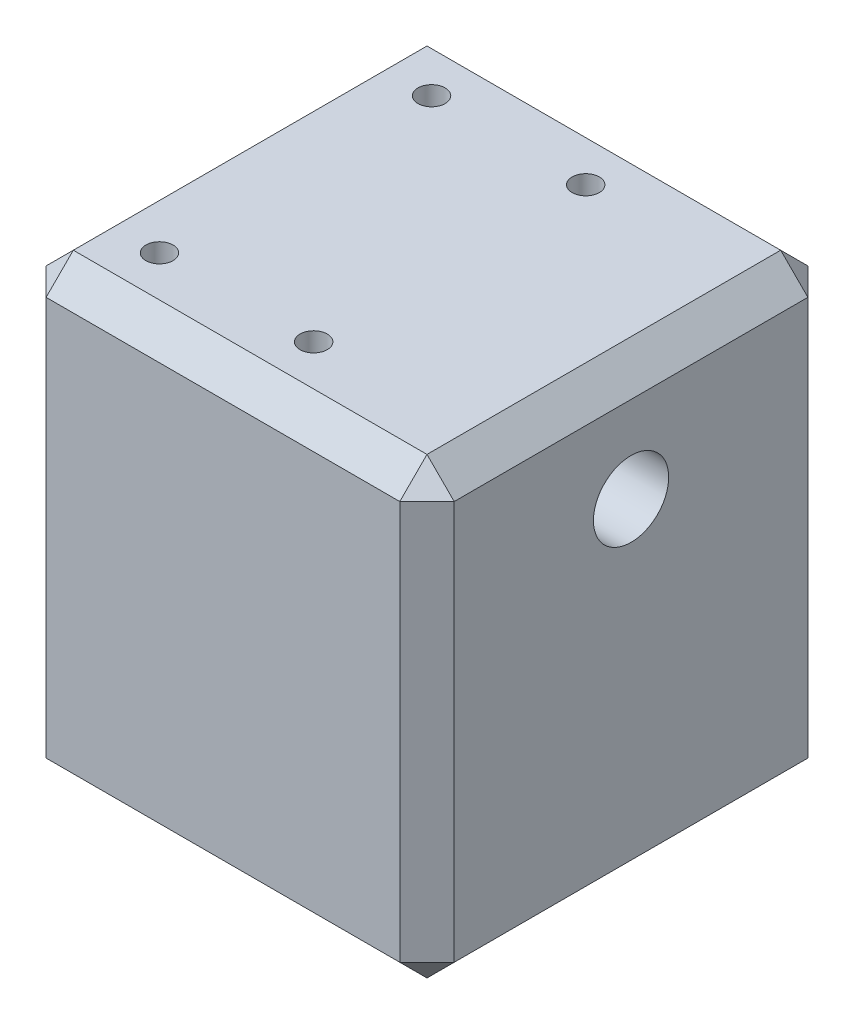
ISO-10303-21;
HEADER;
FILE_DESCRIPTION(('STEP AP214'),'2;1');
FILE_NAME('part.step','',(''),(''),'','','');
FILE_SCHEMA(('AUTOMOTIVE_DESIGN { 1 0 10303 214 1 1 1 1 }'));
ENDSEC;
DATA;
#1=APPLICATION_CONTEXT('core data for automotive mechanical design processes');
#2=APPLICATION_PROTOCOL_DEFINITION('international standard','automotive_design',2000,#1);
#3=PRODUCT_CONTEXT('',#1,'mechanical');
#4=PRODUCT('Part','Part','',(#3));
#5=PRODUCT_RELATED_PRODUCT_CATEGORY('part','',(#4));
#6=PRODUCT_DEFINITION_FORMATION('','',#4);
#7=PRODUCT_DEFINITION_CONTEXT('part definition',#1,'design');
#8=PRODUCT_DEFINITION('design','',#6,#7);
#9=PRODUCT_DEFINITION_SHAPE('','',#8);
#10=(LENGTH_UNIT() NAMED_UNIT(*) SI_UNIT(.MILLI.,.METRE.));
#11=(NAMED_UNIT(*) PLANE_ANGLE_UNIT() SI_UNIT($,.RADIAN.));
#12=(NAMED_UNIT(*) SI_UNIT($,.STERADIAN.) SOLID_ANGLE_UNIT());
#13=UNCERTAINTY_MEASURE_WITH_UNIT(LENGTH_MEASURE(1.E-05),#10,'distance_accuracy_value','');
#14=(GEOMETRIC_REPRESENTATION_CONTEXT(3) GLOBAL_UNCERTAINTY_ASSIGNED_CONTEXT((#13)) GLOBAL_UNIT_ASSIGNED_CONTEXT((#10,
#11,#12)) REPRESENTATION_CONTEXT('',''));
#15=CARTESIAN_POINT('',(0.,0.,0.));
#16=DIRECTION('',(0.,0.,1.));
#17=DIRECTION('',(1.,0.,0.));
#18=AXIS2_PLACEMENT_3D('',#15,#16,#17);
#19=CARTESIAN_POINT('',(22.5,50.,-22.5));
#20=DIRECTION('',(-1.,0.,0.));
#21=DIRECTION('',(0.,0.,1.));
#22=AXIS2_PLACEMENT_3D('',#19,#20,#21);
#23=PLANE('',#22);
#24=DIRECTION('',(0.,-1.,0.));
#25=VECTOR('',#24,1.);
#26=CARTESIAN_POINT('',(22.5,50.,19.5));
#27=LINE('',#26,#25);
#28=CARTESIAN_POINT('',(22.5,47.,19.5));
#29=VERTEX_POINT('',#28);
#30=CARTESIAN_POINT('',(22.5,3.00000000000002,19.5));
#31=VERTEX_POINT('',#30);
#32=EDGE_CURVE('E191',#29,#31,#27,.T.);
#33=ORIENTED_EDGE('',*,*,#32,.T.);
#34=DIRECTION('',(0.,0.,-1.));
#35=VECTOR('',#34,1.);
#36=CARTESIAN_POINT('',(22.5,3.00000000000002,-22.5));
#37=LINE('',#36,#35);
#38=CARTESIAN_POINT('',(22.5,3.00000000000002,-19.5));
#39=VERTEX_POINT('',#38);
#40=EDGE_CURVE('E193',#31,#39,#37,.T.);
#41=ORIENTED_EDGE('',*,*,#40,.T.);
#42=DIRECTION('',(0.,1.,0.));
#43=VECTOR('',#42,1.);
#44=CARTESIAN_POINT('',(22.5,50.,-19.5));
#45=LINE('',#44,#43);
#46=CARTESIAN_POINT('',(22.5,47.,-19.5));
#47=VERTEX_POINT('',#46);
#48=EDGE_CURVE('E187',#39,#47,#45,.T.);
#49=ORIENTED_EDGE('',*,*,#48,.T.);
#50=DIRECTION('',(0.,0.,1.));
#51=VECTOR('',#50,1.);
#52=CARTESIAN_POINT('',(22.5,47.,22.5));
#53=LINE('',#52,#51);
#54=EDGE_CURVE('E189',#47,#29,#53,.T.);
#55=ORIENTED_EDGE('',*,*,#54,.T.);
#56=EDGE_LOOP('',(#33,#41,#49,#55));
#57=FACE_BOUND('',#56,.T.);
#58=CARTESIAN_POINT('',(22.5,37.5,0.));
#59=DIRECTION('',(-1.,0.,0.));
#60=DIRECTION('',(0.,0.,1.));
#61=AXIS2_PLACEMENT_3D('',#58,#59,#60);
#62=CIRCLE('',#61,4.15);
#63=CARTESIAN_POINT('',(22.5,37.5,4.14999999999999));
#64=VERTEX_POINT('',#63);
#65=EDGE_CURVE('E273',#64,#64,#62,.T.);
#66=ORIENTED_EDGE('',*,*,#65,.T.);
#67=EDGE_LOOP('',(#66));
#68=FACE_BOUND('',#67,.T.);
#69=ADVANCED_FACE('F46',(#57,#68),#23,.F.);
#70=CARTESIAN_POINT('',(-22.5,50.,-22.5));
#71=DIRECTION('',(0.,0.,1.));
#72=DIRECTION('',(1.,0.,0.));
#73=AXIS2_PLACEMENT_3D('',#70,#71,#72);
#74=PLANE('',#73);
#75=DIRECTION('',(0.,-1.,0.));
#76=VECTOR('',#75,1.);
#77=CARTESIAN_POINT('',(19.5,50.,-22.5));
#78=LINE('',#77,#76);
#79=CARTESIAN_POINT('',(19.5,47.,-22.5));
#80=VERTEX_POINT('',#79);
#81=CARTESIAN_POINT('',(19.5,3.,-22.5));
#82=VERTEX_POINT('',#81);
#83=EDGE_CURVE('E139',#80,#82,#78,.T.);
#84=ORIENTED_EDGE('',*,*,#83,.T.);
#85=DIRECTION('',(-1.,0.,0.));
#86=VECTOR('',#85,1.);
#87=CARTESIAN_POINT('',(-22.5,3.,-22.5));
#88=LINE('',#87,#86);
#89=CARTESIAN_POINT('',(-19.5,3.,-22.5));
#90=VERTEX_POINT('',#89);
#91=EDGE_CURVE('E176',#82,#90,#88,.T.);
#92=ORIENTED_EDGE('',*,*,#91,.T.);
#93=DIRECTION('',(0.,1.,0.));
#94=VECTOR('',#93,1.);
#95=CARTESIAN_POINT('',(-19.5,50.,-22.5));
#96=LINE('',#95,#94);
#97=CARTESIAN_POINT('',(-19.5,47.,-22.5));
#98=VERTEX_POINT('',#97);
#99=EDGE_CURVE('E142',#90,#98,#96,.T.);
#100=ORIENTED_EDGE('',*,*,#99,.T.);
#101=DIRECTION('',(1.,0.,0.));
#102=VECTOR('',#101,1.);
#103=CARTESIAN_POINT('',(22.5,47.,-22.5));
#104=LINE('',#103,#102);
#105=EDGE_CURVE('E133',#98,#80,#104,.T.);
#106=ORIENTED_EDGE('',*,*,#105,.T.);
#107=EDGE_LOOP('',(#84,#92,#100,#106));
#108=FACE_BOUND('',#107,.T.);
#109=CARTESIAN_POINT('',(0.,12.5,-22.5));
#110=DIRECTION('',(0.,0.,-1.));
#111=DIRECTION('',(-1.,0.,0.));
#112=AXIS2_PLACEMENT_3D('',#109,#110,#111);
#113=CIRCLE('',#112,4.15);
#114=CARTESIAN_POINT('',(-4.15,12.5,-22.5));
#115=VERTEX_POINT('',#114);
#116=EDGE_CURVE('E171',#115,#115,#113,.T.);
#117=ORIENTED_EDGE('',*,*,#116,.F.);
#118=EDGE_LOOP('',(#117));
#119=FACE_BOUND('',#118,.T.);
#120=ADVANCED_FACE('F135',(#108,#119),#74,.F.);
#121=CARTESIAN_POINT('',(-22.5,50.,-22.5));
#122=DIRECTION('',(1.,0.,0.));
#123=DIRECTION('',(0.,0.,-1.));
#124=AXIS2_PLACEMENT_3D('',#121,#122,#123);
#125=PLANE('',#124);
#126=DIRECTION('',(0.,0.,-1.));
#127=VECTOR('',#126,1.);
#128=CARTESIAN_POINT('',(-22.5,47.,-22.5));
#129=LINE('',#128,#127);
#130=CARTESIAN_POINT('',(-22.5,47.,19.5));
#131=VERTEX_POINT('',#130);
#132=CARTESIAN_POINT('',(-22.5,47.,-19.5));
#133=VERTEX_POINT('',#132);
#134=EDGE_CURVE('E205',#131,#133,#129,.T.);
#135=ORIENTED_EDGE('',*,*,#134,.T.);
#136=DIRECTION('',(0.,-1.,0.));
#137=VECTOR('',#136,1.);
#138=CARTESIAN_POINT('',(-22.5,50.,-19.5));
#139=LINE('',#138,#137);
#140=CARTESIAN_POINT('',(-22.5,3.,-19.5));
#141=VERTEX_POINT('',#140);
#142=EDGE_CURVE('E211',#133,#141,#139,.T.);
#143=ORIENTED_EDGE('',*,*,#142,.T.);
#144=DIRECTION('',(0.,0.,1.));
#145=VECTOR('',#144,1.);
#146=CARTESIAN_POINT('',(-22.5,3.,-22.5));
#147=LINE('',#146,#145);
#148=CARTESIAN_POINT('',(-22.5,3.,19.5));
#149=VERTEX_POINT('',#148);
#150=EDGE_CURVE('E209',#141,#149,#147,.T.);
#151=ORIENTED_EDGE('',*,*,#150,.T.);
#152=DIRECTION('',(0.,1.,0.));
#153=VECTOR('',#152,1.);
#154=CARTESIAN_POINT('',(-22.5,50.,19.5));
#155=LINE('',#154,#153);
#156=EDGE_CURVE('E207',#149,#131,#155,.T.);
#157=ORIENTED_EDGE('',*,*,#156,.T.);
#158=EDGE_LOOP('',(#135,#143,#151,#157));
#159=FACE_BOUND('',#158,.T.);
#160=ADVANCED_FACE('F351',(#159),#125,.F.);
#161=CARTESIAN_POINT('',(-22.5,50.,22.5));
#162=DIRECTION('',(0.,0.,-1.));
#163=DIRECTION('',(-1.,0.,0.));
#164=AXIS2_PLACEMENT_3D('',#161,#162,#163);
#165=PLANE('',#164);
#166=DIRECTION('',(1.,0.,0.));
#167=VECTOR('',#166,1.);
#168=CARTESIAN_POINT('',(-22.5,3.,22.5));
#169=LINE('',#168,#167);
#170=CARTESIAN_POINT('',(-19.5,3.,22.5));
#171=VERTEX_POINT('',#170);
#172=CARTESIAN_POINT('',(19.5,3.,22.5));
#173=VERTEX_POINT('',#172);
#174=EDGE_CURVE('E200',#171,#173,#169,.T.);
#175=ORIENTED_EDGE('',*,*,#174,.T.);
#176=DIRECTION('',(0.,1.,0.));
#177=VECTOR('',#176,1.);
#178=CARTESIAN_POINT('',(19.5,50.,22.5));
#179=LINE('',#178,#177);
#180=CARTESIAN_POINT('',(19.5,47.,22.5));
#181=VERTEX_POINT('',#180);
#182=EDGE_CURVE('E202',#173,#181,#179,.T.);
#183=ORIENTED_EDGE('',*,*,#182,.T.);
#184=DIRECTION('',(-1.,0.,0.));
#185=VECTOR('',#184,1.);
#186=CARTESIAN_POINT('',(-22.5,47.,22.5));
#187=LINE('',#186,#185);
#188=CARTESIAN_POINT('',(-19.5,47.,22.5));
#189=VERTEX_POINT('',#188);
#190=EDGE_CURVE('E196',#181,#189,#187,.T.);
#191=ORIENTED_EDGE('',*,*,#190,.T.);
#192=DIRECTION('',(0.,-1.,0.));
#193=VECTOR('',#192,1.);
#194=CARTESIAN_POINT('',(-19.5,50.,22.5));
#195=LINE('',#194,#193);
#196=EDGE_CURVE('E198',#189,#171,#195,.T.);
#197=ORIENTED_EDGE('',*,*,#196,.T.);
#198=EDGE_LOOP('',(#175,#183,#191,#197));
#199=FACE_BOUND('',#198,.T.);
#200=ADVANCED_FACE('F324',(#199),#165,.F.);
#201=CARTESIAN_POINT('',(0.,50.,0.));
#202=DIRECTION('',(0.,1.,0.));
#203=DIRECTION('',(0.,0.,1.));
#204=AXIS2_PLACEMENT_3D('',#201,#202,#203);
#205=PLANE('',#204);
#206=CARTESIAN_POINT('',(-14.5,50.,-15.0000000000001));
#207=DIRECTION('',(0.,1.,0.));
#208=DIRECTION('',(0.,0.,-1.));
#209=AXIS2_PLACEMENT_3D('',#206,#207,#208);
#210=CIRCLE('',#209,1.5);
#211=CARTESIAN_POINT('',(-14.5,50.,-16.5000000000001));
#212=VERTEX_POINT('',#211);
#213=EDGE_CURVE('E293',#212,#212,#210,.T.);
#214=ORIENTED_EDGE('',*,*,#213,.F.);
#215=EDGE_LOOP('',(#214));
#216=FACE_BOUND('',#215,.T.);
#217=CARTESIAN_POINT('',(2.49999999999996,50.,-15.0000000000001));
#218=DIRECTION('',(0.,1.,0.));
#219=DIRECTION('',(0.,0.,-1.));
#220=AXIS2_PLACEMENT_3D('',#217,#218,#219);
#221=CIRCLE('',#220,1.5);
#222=CARTESIAN_POINT('',(2.49999999999996,50.,-16.5000000000001));
#223=VERTEX_POINT('',#222);
#224=EDGE_CURVE('E299',#223,#223,#221,.T.);
#225=ORIENTED_EDGE('',*,*,#224,.F.);
#226=EDGE_LOOP('',(#225));
#227=FACE_BOUND('',#226,.T.);
#228=CARTESIAN_POINT('',(2.49999999999996,50.,15.0000000000001));
#229=DIRECTION('',(0.,1.,0.));
#230=DIRECTION('',(0.,0.,1.));
#231=AXIS2_PLACEMENT_3D('',#228,#229,#230);
#232=CIRCLE('',#231,1.5);
#233=CARTESIAN_POINT('',(2.49999999999996,50.,16.5000000000001));
#234=VERTEX_POINT('',#233);
#235=EDGE_CURVE('E305',#234,#234,#232,.T.);
#236=ORIENTED_EDGE('',*,*,#235,.F.);
#237=EDGE_LOOP('',(#236));
#238=FACE_BOUND('',#237,.T.);
#239=CARTESIAN_POINT('',(-14.5,50.,15.0000000000001));
#240=DIRECTION('',(0.,1.,0.));
#241=DIRECTION('',(0.,0.,1.));
#242=AXIS2_PLACEMENT_3D('',#239,#240,#241);
#243=CIRCLE('',#242,1.5);
#244=CARTESIAN_POINT('',(-14.5,50.,16.5000000000001));
#245=VERTEX_POINT('',#244);
#246=EDGE_CURVE('E287',#245,#245,#243,.T.);
#247=ORIENTED_EDGE('',*,*,#246,.F.);
#248=EDGE_LOOP('',(#247));
#249=FACE_BOUND('',#248,.T.);
#250=DIRECTION('',(0.,0.,1.));
#251=VECTOR('',#250,1.);
#252=CARTESIAN_POINT('',(-19.5,50.,22.5));
#253=LINE('',#252,#251);
#254=CARTESIAN_POINT('',(-19.5,50.,-19.5));
#255=VERTEX_POINT('',#254);
#256=CARTESIAN_POINT('',(-19.5,50.,19.5));
#257=VERTEX_POINT('',#256);
#258=EDGE_CURVE('E55',#255,#257,#253,.T.);
#259=ORIENTED_EDGE('',*,*,#258,.T.);
#260=DIRECTION('',(1.,0.,0.));
#261=VECTOR('',#260,1.);
#262=CARTESIAN_POINT('',(22.5,50.,19.5));
#263=LINE('',#262,#261);
#264=CARTESIAN_POINT('',(19.5,50.,19.5));
#265=VERTEX_POINT('',#264);
#266=EDGE_CURVE('E13',#257,#265,#263,.T.);
#267=ORIENTED_EDGE('',*,*,#266,.T.);
#268=DIRECTION('',(0.,0.,-1.));
#269=VECTOR('',#268,1.);
#270=CARTESIAN_POINT('',(19.5,50.,-22.5));
#271=LINE('',#270,#269);
#272=CARTESIAN_POINT('',(19.5,50.,-19.5));
#273=VERTEX_POINT('',#272);
#274=EDGE_CURVE('E214',#265,#273,#271,.T.);
#275=ORIENTED_EDGE('',*,*,#274,.T.);
#276=DIRECTION('',(-1.,0.,0.));
#277=VECTOR('',#276,1.);
#278=CARTESIAN_POINT('',(-22.5,50.,-19.5));
#279=LINE('',#278,#277);
#280=EDGE_CURVE('E66',#273,#255,#279,.T.);
#281=ORIENTED_EDGE('',*,*,#280,.T.);
#282=EDGE_LOOP('',(#259,#267,#275,#281));
#283=FACE_BOUND('',#282,.T.);
#284=ADVANCED_FACE('F320',(#216,#227,#238,#249,#283),#205,.T.);
#285=CARTESIAN_POINT('',(0.,0.,0.));
#286=DIRECTION('',(0.,1.,0.));
#287=DIRECTION('',(0.,0.,1.));
#288=AXIS2_PLACEMENT_3D('',#285,#286,#287);
#289=PLANE('',#288);
#290=DIRECTION('',(0.,0.,-1.));
#291=VECTOR('',#290,1.);
#292=CARTESIAN_POINT('',(-19.5,0.,0.));
#293=LINE('',#292,#291);
#294=CARTESIAN_POINT('',(-19.5,0.,19.5));
#295=VERTEX_POINT('',#294);
#296=CARTESIAN_POINT('',(-19.5,0.,-19.5));
#297=VERTEX_POINT('',#296);
#298=EDGE_CURVE('E178',#295,#297,#293,.T.);
#299=ORIENTED_EDGE('',*,*,#298,.T.);
#300=DIRECTION('',(1.,0.,0.));
#301=VECTOR('',#300,1.);
#302=CARTESIAN_POINT('',(0.,0.,-19.5));
#303=LINE('',#302,#301);
#304=CARTESIAN_POINT('',(19.5,0.,-19.5));
#305=VERTEX_POINT('',#304);
#306=EDGE_CURVE('E184',#297,#305,#303,.T.);
#307=ORIENTED_EDGE('',*,*,#306,.T.);
#308=DIRECTION('',(0.,0.,1.));
#309=VECTOR('',#308,1.);
#310=CARTESIAN_POINT('',(19.5,0.,0.));
#311=LINE('',#310,#309);
#312=CARTESIAN_POINT('',(19.5,0.,19.5));
#313=VERTEX_POINT('',#312);
#314=EDGE_CURVE('E182',#305,#313,#311,.T.);
#315=ORIENTED_EDGE('',*,*,#314,.T.);
#316=DIRECTION('',(-1.,0.,0.));
#317=VECTOR('',#316,1.);
#318=CARTESIAN_POINT('',(0.,0.,19.5));
#319=LINE('',#318,#317);
#320=EDGE_CURVE('E180',#313,#295,#319,.T.);
#321=ORIENTED_EDGE('',*,*,#320,.T.);
#322=EDGE_LOOP('',(#299,#307,#315,#321));
#323=FACE_BOUND('',#322,.T.);
#324=ADVANCED_FACE('F323',(#323),#289,.F.);
#325=CARTESIAN_POINT('',(0.,12.5,7.5));
#326=DIRECTION('',(0.,0.,-1.));
#327=DIRECTION('',(-1.,0.,0.));
#328=AXIS2_PLACEMENT_3D('',#325,#326,#327);
#329=CYLINDRICAL_SURFACE('',#328,4.15);
#330=CARTESIAN_POINT('',(0.,12.5,7.5));
#331=DIRECTION('',(0.,0.,-1.));
#332=DIRECTION('',(-1.,0.,0.));
#333=AXIS2_PLACEMENT_3D('',#330,#331,#332);
#334=CIRCLE('',#333,4.15);
#335=CARTESIAN_POINT('',(-4.15,12.5,7.5));
#336=VERTEX_POINT('',#335);
#337=EDGE_CURVE('E168',#336,#336,#334,.T.);
#338=ORIENTED_EDGE('',*,*,#337,.F.);
#339=EDGE_LOOP('',(#338));
#340=FACE_BOUND('',#339,.T.);
#341=ORIENTED_EDGE('',*,*,#116,.T.);
#342=EDGE_LOOP('',(#341));
#343=FACE_BOUND('',#342,.T.);
#344=ADVANCED_FACE('F458',(#340,#343),#329,.F.);
#345=CARTESIAN_POINT('',(0.,12.5,7.5));
#346=DIRECTION('',(0.,0.,-1.));
#347=DIRECTION('',(-1.,0.,0.));
#348=AXIS2_PLACEMENT_3D('',#345,#346,#347);
#349=PLANE('',#348);
#350=ORIENTED_EDGE('',*,*,#337,.T.);
#351=EDGE_LOOP('',(#350));
#352=FACE_BOUND('',#351,.T.);
#353=ADVANCED_FACE('F462',(#352),#349,.T.);
#354=CARTESIAN_POINT('',(-7.49999999999999,37.5,0.));
#355=DIRECTION('',(1.,0.,0.));
#356=DIRECTION('',(0.,0.,-1.));
#357=AXIS2_PLACEMENT_3D('',#354,#355,#356);
#358=CYLINDRICAL_SURFACE('',#357,4.15);
#359=CARTESIAN_POINT('',(-7.49999999999999,37.5,0.));
#360=DIRECTION('',(-1.,0.,0.));
#361=DIRECTION('',(0.,0.,1.));
#362=AXIS2_PLACEMENT_3D('',#359,#360,#361);
#363=CIRCLE('',#362,4.15);
#364=CARTESIAN_POINT('',(-7.49999999999999,37.5,4.15));
#365=VERTEX_POINT('',#364);
#366=EDGE_CURVE('E280',#365,#365,#363,.T.);
#367=ORIENTED_EDGE('',*,*,#366,.T.);
#368=EDGE_LOOP('',(#367));
#369=FACE_BOUND('',#368,.T.);
#370=ORIENTED_EDGE('',*,*,#65,.F.);
#371=EDGE_LOOP('',(#370));
#372=FACE_BOUND('',#371,.T.);
#373=ADVANCED_FACE('F466',(#369,#372),#358,.F.);
#374=CARTESIAN_POINT('',(-7.49999999999999,37.5,0.));
#375=DIRECTION('',(-1.,0.,0.));
#376=DIRECTION('',(0.,0.,1.));
#377=AXIS2_PLACEMENT_3D('',#374,#375,#376);
#378=PLANE('',#377);
#379=ORIENTED_EDGE('',*,*,#366,.F.);
#380=EDGE_LOOP('',(#379));
#381=FACE_BOUND('',#380,.T.);
#382=ADVANCED_FACE('F419',(#381),#378,.F.);
#383=CARTESIAN_POINT('',(0.,50.,19.5));
#384=DIRECTION('',(0.,0.707106781186546,0.707106781186549));
#385=DIRECTION('',(-1.,0.,0.));
#386=AXIS2_PLACEMENT_3D('',#383,#384,#385);
#387=PLANE('',#386);
#388=DIRECTION('',(0.,-0.707106781186549,0.707106781186546));
#389=VECTOR('',#388,1.);
#390=CARTESIAN_POINT('',(19.5,47.,22.5));
#391=LINE('',#390,#389);
#392=EDGE_CURVE('E50',#265,#181,#391,.T.);
#393=ORIENTED_EDGE('',*,*,#392,.F.);
#394=ORIENTED_EDGE('',*,*,#266,.F.);
#395=DIRECTION('',(0.,0.707106781186549,-0.707106781186546));
#396=VECTOR('',#395,1.);
#397=CARTESIAN_POINT('',(-19.5,48.5,21.));
#398=LINE('',#397,#396);
#399=EDGE_CURVE('E266',#189,#257,#398,.T.);
#400=ORIENTED_EDGE('',*,*,#399,.F.);
#401=ORIENTED_EDGE('',*,*,#190,.F.);
#402=EDGE_LOOP('',(#393,#394,#400,#401));
#403=FACE_BOUND('',#402,.T.);
#404=ADVANCED_FACE('F48',(#403),#387,.T.);
#405=CARTESIAN_POINT('',(19.5,47.,22.5));
#406=DIRECTION('',(0.577350269189629,0.577350269189622,0.577350269189626));
#407=DIRECTION('',(0.707106781186546,0.,-0.707106781186549));
#408=AXIS2_PLACEMENT_3D('',#405,#406,#407);
#409=PLANE('',#408);
#410=DIRECTION('',(-0.707106781186546,0.707106781186549,0.));
#411=VECTOR('',#410,1.);
#412=CARTESIAN_POINT('',(21.,48.5,19.5));
#413=LINE('',#412,#411);
#414=EDGE_CURVE('E262',#265,#29,#413,.F.);
#415=ORIENTED_EDGE('',*,*,#414,.F.);
#416=ORIENTED_EDGE('',*,*,#392,.T.);
#417=DIRECTION('',(-0.707106781186546,0.,0.707106781186549));
#418=VECTOR('',#417,1.);
#419=CARTESIAN_POINT('',(19.5,47.,22.5));
#420=LINE('',#419,#418);
#421=EDGE_CURVE('E265',#29,#181,#420,.T.);
#422=ORIENTED_EDGE('',*,*,#421,.F.);
#423=EDGE_LOOP('',(#415,#416,#422));
#424=FACE_BOUND('',#423,.T.);
#425=ADVANCED_FACE('F414',(#424),#409,.T.);
#426=CARTESIAN_POINT('',(-22.5,47.,19.5));
#427=DIRECTION('',(-0.577350269189629,0.577350269189623,0.577350269189625));
#428=DIRECTION('',(0.707106781186545,0.,0.70710678118655));
#429=AXIS2_PLACEMENT_3D('',#426,#427,#428);
#430=PLANE('',#429);
#431=DIRECTION('',(-0.707106781186545,0.,-0.70710678118655));
#432=VECTOR('',#431,1.);
#433=CARTESIAN_POINT('',(-22.5,47.,19.5));
#434=LINE('',#433,#432);
#435=EDGE_CURVE('E256',#189,#131,#434,.T.);
#436=ORIENTED_EDGE('',*,*,#435,.F.);
#437=ORIENTED_EDGE('',*,*,#399,.T.);
#438=DIRECTION('',(-0.707106781186546,-0.707106781186549,0.));
#439=VECTOR('',#438,1.);
#440=CARTESIAN_POINT('',(-22.5,47.,19.5));
#441=LINE('',#440,#439);
#442=EDGE_CURVE('E259',#131,#257,#441,.F.);
#443=ORIENTED_EDGE('',*,*,#442,.F.);
#444=EDGE_LOOP('',(#436,#437,#443));
#445=FACE_BOUND('',#444,.T.);
#446=ADVANCED_FACE('F411',(#445),#430,.T.);
#447=CARTESIAN_POINT('',(22.5,50.,19.5));
#448=DIRECTION('',(-0.707106781186549,0.,-0.707106781186546));
#449=DIRECTION('',(0.,-1.,0.));
#450=AXIS2_PLACEMENT_3D('',#447,#448,#449);
#451=PLANE('',#450);
#452=ORIENTED_EDGE('',*,*,#421,.T.);
#453=ORIENTED_EDGE('',*,*,#182,.F.);
#454=DIRECTION('',(0.707106781186546,0.,-0.707106781186549));
#455=VECTOR('',#454,1.);
#456=CARTESIAN_POINT('',(21.,3.00000000000001,21.));
#457=LINE('',#456,#455);
#458=EDGE_CURVE('E250',#31,#173,#457,.F.);
#459=ORIENTED_EDGE('',*,*,#458,.F.);
#460=ORIENTED_EDGE('',*,*,#32,.F.);
#461=EDGE_LOOP('',(#452,#453,#459,#460));
#462=FACE_BOUND('',#461,.T.);
#463=ADVANCED_FACE('F407',(#462),#451,.F.);
#464=CARTESIAN_POINT('',(19.5,50.,0.));
#465=DIRECTION('',(0.707106781186549,0.707106781186546,0.));
#466=DIRECTION('',(0.,0.,1.));
#467=AXIS2_PLACEMENT_3D('',#464,#465,#466);
#468=PLANE('',#467);
#469=ORIENTED_EDGE('',*,*,#414,.T.);
#470=ORIENTED_EDGE('',*,*,#54,.F.);
#471=DIRECTION('',(0.707106781186546,-0.707106781186549,0.));
#472=VECTOR('',#471,1.);
#473=CARTESIAN_POINT('',(21.,48.5,-19.5));
#474=LINE('',#473,#472);
#475=EDGE_CURVE('E154',#273,#47,#474,.T.);
#476=ORIENTED_EDGE('',*,*,#475,.F.);
#477=ORIENTED_EDGE('',*,*,#274,.F.);
#478=EDGE_LOOP('',(#469,#470,#476,#477));
#479=FACE_BOUND('',#478,.T.);
#480=ADVANCED_FACE('F404',(#479),#468,.T.);
#481=CARTESIAN_POINT('',(0.,50.,-19.5));
#482=DIRECTION('',(0.,0.707106781186549,-0.707106781186546));
#483=DIRECTION('',(1.,0.,0.));
#484=AXIS2_PLACEMENT_3D('',#481,#482,#483);
#485=PLANE('',#484);
#486=DIRECTION('',(0.,-0.707106781186546,-0.707106781186549));
#487=VECTOR('',#486,1.);
#488=CARTESIAN_POINT('',(-19.5,47.,-22.5));
#489=LINE('',#488,#487);
#490=EDGE_CURVE('E155',#255,#98,#489,.T.);
#491=ORIENTED_EDGE('',*,*,#490,.F.);
#492=ORIENTED_EDGE('',*,*,#280,.F.);
#493=DIRECTION('',(0.,0.707106781186546,0.707106781186549));
#494=VECTOR('',#493,1.);
#495=CARTESIAN_POINT('',(19.5,47.,-22.5));
#496=LINE('',#495,#494);
#497=EDGE_CURVE('E148',#80,#273,#496,.T.);
#498=ORIENTED_EDGE('',*,*,#497,.F.);
#499=ORIENTED_EDGE('',*,*,#105,.F.);
#500=EDGE_LOOP('',(#491,#492,#498,#499));
#501=FACE_BOUND('',#500,.T.);
#502=ADVANCED_FACE('F150',(#501),#485,.T.);
#503=CARTESIAN_POINT('',(-19.5,50.,0.));
#504=DIRECTION('',(-0.707106781186549,0.707106781186546,0.));
#505=DIRECTION('',(0.,0.,-1.));
#506=AXIS2_PLACEMENT_3D('',#503,#504,#505);
#507=PLANE('',#506);
#508=ORIENTED_EDGE('',*,*,#442,.T.);
#509=ORIENTED_EDGE('',*,*,#258,.F.);
#510=DIRECTION('',(0.707106781186546,0.707106781186549,0.));
#511=VECTOR('',#510,1.);
#512=CARTESIAN_POINT('',(-21.,48.5,-19.5));
#513=LINE('',#512,#511);
#514=EDGE_CURVE('E245',#133,#255,#513,.T.);
#515=ORIENTED_EDGE('',*,*,#514,.F.);
#516=ORIENTED_EDGE('',*,*,#134,.F.);
#517=EDGE_LOOP('',(#508,#509,#515,#516));
#518=FACE_BOUND('',#517,.T.);
#519=ADVANCED_FACE('F397',(#518),#507,.T.);
#520=CARTESIAN_POINT('',(-19.5,50.,22.5));
#521=DIRECTION('',(0.70710678118655,0.,-0.707106781186545));
#522=DIRECTION('',(0.,-1.,0.));
#523=AXIS2_PLACEMENT_3D('',#520,#521,#522);
#524=PLANE('',#523);
#525=ORIENTED_EDGE('',*,*,#435,.T.);
#526=ORIENTED_EDGE('',*,*,#156,.F.);
#527=DIRECTION('',(0.707106781186545,0.,0.70710678118655));
#528=VECTOR('',#527,1.);
#529=CARTESIAN_POINT('',(-21.,3.,21.));
#530=LINE('',#529,#528);
#531=EDGE_CURVE('E242',#171,#149,#530,.F.);
#532=ORIENTED_EDGE('',*,*,#531,.F.);
#533=ORIENTED_EDGE('',*,*,#196,.F.);
#534=EDGE_LOOP('',(#525,#526,#532,#533));
#535=FACE_BOUND('',#534,.T.);
#536=ADVANCED_FACE('F393',(#535),#524,.F.);
#537=CARTESIAN_POINT('',(-22.5,3.,22.5));
#538=DIRECTION('',(0.,0.707106781186549,-0.707106781186546));
#539=DIRECTION('',(1.,0.,0.));
#540=AXIS2_PLACEMENT_3D('',#537,#538,#539);
#541=PLANE('',#540);
#542=DIRECTION('',(0.,0.707106781186546,0.707106781186549));
#543=VECTOR('',#542,1.);
#544=CARTESIAN_POINT('',(19.5,0.,19.5));
#545=LINE('',#544,#543);
#546=EDGE_CURVE('E253',#173,#313,#545,.F.);
#547=ORIENTED_EDGE('',*,*,#546,.F.);
#548=ORIENTED_EDGE('',*,*,#174,.F.);
#549=DIRECTION('',(0.,-0.707106781186546,-0.707106781186549));
#550=VECTOR('',#549,1.);
#551=CARTESIAN_POINT('',(-19.5,0.,19.5));
#552=LINE('',#551,#550);
#553=EDGE_CURVE('E239',#295,#171,#552,.F.);
#554=ORIENTED_EDGE('',*,*,#553,.F.);
#555=ORIENTED_EDGE('',*,*,#320,.F.);
#556=EDGE_LOOP('',(#547,#548,#554,#555));
#557=FACE_BOUND('',#556,.T.);
#558=ADVANCED_FACE('F389',(#557),#541,.F.);
#559=CARTESIAN_POINT('',(19.5,0.,19.5));
#560=DIRECTION('',(0.577350269189629,-0.577350269189625,0.577350269189624));
#561=DIRECTION('',(0.707106781186545,0.70710678118655,0.));
#562=AXIS2_PLACEMENT_3D('',#559,#560,#561);
#563=PLANE('',#562);
#564=ORIENTED_EDGE('',*,*,#458,.T.);
#565=ORIENTED_EDGE('',*,*,#546,.T.);
#566=DIRECTION('',(-0.707106781186546,-0.707106781186549,0.));
#567=VECTOR('',#566,1.);
#568=CARTESIAN_POINT('',(19.5,0.,19.5));
#569=LINE('',#568,#567);
#570=EDGE_CURVE('E162',#31,#313,#569,.T.);
#571=ORIENTED_EDGE('',*,*,#570,.F.);
#572=EDGE_LOOP('',(#564,#565,#571));
#573=FACE_BOUND('',#572,.T.);
#574=ADVANCED_FACE('F386',(#573),#563,.T.);
#575=CARTESIAN_POINT('',(19.5,47.,-22.5));
#576=DIRECTION('',(0.577350269189628,0.577350269189625,-0.577350269189624));
#577=DIRECTION('',(-0.707106781186546,0.707106781186549,0.));
#578=AXIS2_PLACEMENT_3D('',#575,#576,#577);
#579=PLANE('',#578);
#580=ORIENTED_EDGE('',*,*,#497,.T.);
#581=ORIENTED_EDGE('',*,*,#475,.T.);
#582=DIRECTION('',(0.707106781186547,0.,0.707106781186548));
#583=VECTOR('',#582,1.);
#584=CARTESIAN_POINT('',(19.5,47.,-22.5));
#585=LINE('',#584,#583);
#586=EDGE_CURVE('E158',#80,#47,#585,.T.);
#587=ORIENTED_EDGE('',*,*,#586,.F.);
#588=EDGE_LOOP('',(#580,#581,#587));
#589=FACE_BOUND('',#588,.T.);
#590=ADVANCED_FACE('F159',(#589),#579,.T.);
#591=CARTESIAN_POINT('',(-19.5,47.,-22.5));
#592=DIRECTION('',(-0.577350269189629,0.577350269189626,-0.577350269189623));
#593=DIRECTION('',(-0.707106781186546,-0.707106781186549,0.));
#594=AXIS2_PLACEMENT_3D('',#591,#592,#593);
#595=PLANE('',#594);
#596=ORIENTED_EDGE('',*,*,#514,.T.);
#597=ORIENTED_EDGE('',*,*,#490,.T.);
#598=DIRECTION('',(0.707106781186546,0.,-0.707106781186549));
#599=VECTOR('',#598,1.);
#600=CARTESIAN_POINT('',(-19.5,47.,-22.5));
#601=LINE('',#600,#599);
#602=EDGE_CURVE('E163',#133,#98,#601,.T.);
#603=ORIENTED_EDGE('',*,*,#602,.F.);
#604=EDGE_LOOP('',(#596,#597,#603));
#605=FACE_BOUND('',#604,.T.);
#606=ADVANCED_FACE('F379',(#605),#595,.T.);
#607=CARTESIAN_POINT('',(-19.5,0.,19.5));
#608=DIRECTION('',(-0.577350269189627,-0.577350269189628,0.577350269189623));
#609=DIRECTION('',(0.707106781186548,-0.707106781186547,0.));
#610=AXIS2_PLACEMENT_3D('',#607,#608,#609);
#611=PLANE('',#610);
#612=ORIENTED_EDGE('',*,*,#553,.T.);
#613=ORIENTED_EDGE('',*,*,#531,.T.);
#614=DIRECTION('',(-0.707106781186549,0.707106781186546,0.));
#615=VECTOR('',#614,1.);
#616=CARTESIAN_POINT('',(-19.5,0.,19.5));
#617=LINE('',#616,#615);
#618=EDGE_CURVE('E232',#295,#149,#617,.T.);
#619=ORIENTED_EDGE('',*,*,#618,.F.);
#620=EDGE_LOOP('',(#612,#613,#619));
#621=FACE_BOUND('',#620,.T.);
#622=ADVANCED_FACE('F375',(#621),#611,.T.);
#623=CARTESIAN_POINT('',(22.5,3.00000000000002,-22.5));
#624=DIRECTION('',(-0.707106781186549,0.707106781186546,0.));
#625=DIRECTION('',(0.,0.,-1.));
#626=AXIS2_PLACEMENT_3D('',#623,#624,#625);
#627=PLANE('',#626);
#628=ORIENTED_EDGE('',*,*,#570,.T.);
#629=ORIENTED_EDGE('',*,*,#314,.F.);
#630=DIRECTION('',(0.707106781186546,0.707106781186549,0.));
#631=VECTOR('',#630,1.);
#632=CARTESIAN_POINT('',(19.5,0.,-19.5));
#633=LINE('',#632,#631);
#634=EDGE_CURVE('E229',#39,#305,#633,.F.);
#635=ORIENTED_EDGE('',*,*,#634,.F.);
#636=ORIENTED_EDGE('',*,*,#40,.F.);
#637=EDGE_LOOP('',(#628,#629,#635,#636));
#638=FACE_BOUND('',#637,.T.);
#639=ADVANCED_FACE('F372',(#638),#627,.F.);
#640=CARTESIAN_POINT('',(19.5,50.,-22.5));
#641=DIRECTION('',(-0.707106781186548,0.,0.707106781186547));
#642=DIRECTION('',(0.,-1.,0.));
#643=AXIS2_PLACEMENT_3D('',#640,#641,#642);
#644=PLANE('',#643);
#645=ORIENTED_EDGE('',*,*,#586,.T.);
#646=ORIENTED_EDGE('',*,*,#48,.F.);
#647=DIRECTION('',(-0.707106781186547,0.,-0.707106781186548));
#648=VECTOR('',#647,1.);
#649=CARTESIAN_POINT('',(21.,3.00000000000001,-21.));
#650=LINE('',#649,#648);
#651=EDGE_CURVE('E166',#82,#39,#650,.F.);
#652=ORIENTED_EDGE('',*,*,#651,.F.);
#653=ORIENTED_EDGE('',*,*,#83,.F.);
#654=EDGE_LOOP('',(#645,#646,#652,#653));
#655=FACE_BOUND('',#654,.T.);
#656=ADVANCED_FACE('F165',(#655),#644,.F.);
#657=CARTESIAN_POINT('',(-22.5,50.,-19.5));
#658=DIRECTION('',(0.707106781186549,0.,0.707106781186546));
#659=DIRECTION('',(0.,-1.,0.));
#660=AXIS2_PLACEMENT_3D('',#657,#658,#659);
#661=PLANE('',#660);
#662=ORIENTED_EDGE('',*,*,#602,.T.);
#663=ORIENTED_EDGE('',*,*,#99,.F.);
#664=DIRECTION('',(-0.707106781186546,0.,0.707106781186549));
#665=VECTOR('',#664,1.);
#666=CARTESIAN_POINT('',(-19.5,3.,-22.5));
#667=LINE('',#666,#665);
#668=EDGE_CURVE('E225',#141,#90,#667,.F.);
#669=ORIENTED_EDGE('',*,*,#668,.F.);
#670=ORIENTED_EDGE('',*,*,#142,.F.);
#671=EDGE_LOOP('',(#662,#663,#669,#670));
#672=FACE_BOUND('',#671,.T.);
#673=ADVANCED_FACE('F365',(#672),#661,.F.);
#674=CARTESIAN_POINT('',(-22.5,3.,-22.5));
#675=DIRECTION('',(0.707106781186546,0.707106781186549,0.));
#676=DIRECTION('',(0.,0.,1.));
#677=AXIS2_PLACEMENT_3D('',#674,#675,#676);
#678=PLANE('',#677);
#679=ORIENTED_EDGE('',*,*,#618,.T.);
#680=ORIENTED_EDGE('',*,*,#150,.F.);
#681=DIRECTION('',(0.707106781186549,-0.707106781186546,0.));
#682=VECTOR('',#681,1.);
#683=CARTESIAN_POINT('',(-21.,1.5,-19.5));
#684=LINE('',#683,#682);
#685=EDGE_CURVE('E223',#297,#141,#684,.F.);
#686=ORIENTED_EDGE('',*,*,#685,.F.);
#687=ORIENTED_EDGE('',*,*,#298,.F.);
#688=EDGE_LOOP('',(#679,#680,#686,#687));
#689=FACE_BOUND('',#688,.T.);
#690=ADVANCED_FACE('F361',(#689),#678,.F.);
#691=CARTESIAN_POINT('',(19.5,0.,-19.5));
#692=DIRECTION('',(0.577350269189628,-0.577350269189625,-0.577350269189624));
#693=DIRECTION('',(0.707106781186546,0.707106781186549,0.));
#694=AXIS2_PLACEMENT_3D('',#691,#692,#693);
#695=PLANE('',#694);
#696=ORIENTED_EDGE('',*,*,#651,.T.);
#697=ORIENTED_EDGE('',*,*,#634,.T.);
#698=DIRECTION('',(0.,-0.707106781186546,0.707106781186549));
#699=VECTOR('',#698,1.);
#700=CARTESIAN_POINT('',(19.5,0.,-19.5));
#701=LINE('',#700,#699);
#702=EDGE_CURVE('E220',#82,#305,#701,.T.);
#703=ORIENTED_EDGE('',*,*,#702,.F.);
#704=EDGE_LOOP('',(#696,#697,#703));
#705=FACE_BOUND('',#704,.T.);
#706=ADVANCED_FACE('F357',(#705),#695,.T.);
#707=CARTESIAN_POINT('',(-19.5,3.,-22.5));
#708=DIRECTION('',(-0.577350269189626,-0.577350269189629,-0.577350269189623));
#709=DIRECTION('',(0.707106781186549,-0.707106781186546,0.));
#710=AXIS2_PLACEMENT_3D('',#707,#708,#709);
#711=PLANE('',#710);
#712=ORIENTED_EDGE('',*,*,#685,.T.);
#713=ORIENTED_EDGE('',*,*,#668,.T.);
#714=DIRECTION('',(0.,0.707106781186546,-0.707106781186549));
#715=VECTOR('',#714,1.);
#716=CARTESIAN_POINT('',(-19.5,3.,-22.5));
#717=LINE('',#716,#715);
#718=EDGE_CURVE('E218',#297,#90,#717,.T.);
#719=ORIENTED_EDGE('',*,*,#718,.F.);
#720=EDGE_LOOP('',(#712,#713,#719));
#721=FACE_BOUND('',#720,.T.);
#722=ADVANCED_FACE('F340',(#721),#711,.T.);
#723=CARTESIAN_POINT('',(-22.5,3.,-22.5));
#724=DIRECTION('',(0.,0.707106781186549,0.707106781186546));
#725=DIRECTION('',(-1.,0.,0.));
#726=AXIS2_PLACEMENT_3D('',#723,#724,#725);
#727=PLANE('',#726);
#728=ORIENTED_EDGE('',*,*,#702,.T.);
#729=ORIENTED_EDGE('',*,*,#306,.F.);
#730=ORIENTED_EDGE('',*,*,#718,.T.);
#731=ORIENTED_EDGE('',*,*,#91,.F.);
#732=EDGE_LOOP('',(#728,#729,#730,#731));
#733=FACE_BOUND('',#732,.T.);
#734=ADVANCED_FACE('F331',(#733),#727,.F.);
#735=CARTESIAN_POINT('',(-14.5,40.,15.0000000000001));
#736=DIRECTION('',(0.,1.,0.));
#737=DIRECTION('',(0.,0.,1.));
#738=AXIS2_PLACEMENT_3D('',#735,#736,#737);
#739=CYLINDRICAL_SURFACE('',#738,1.5);
#740=CARTESIAN_POINT('',(-14.5,40.,15.0000000000001));
#741=DIRECTION('',(0.,1.,0.));
#742=DIRECTION('',(0.,0.,1.));
#743=AXIS2_PLACEMENT_3D('',#740,#741,#742);
#744=CIRCLE('',#743,1.5);
#745=CARTESIAN_POINT('',(-14.5,40.,16.5000000000001));
#746=VERTEX_POINT('',#745);
#747=EDGE_CURVE('E221',#746,#746,#744,.T.);
#748=ORIENTED_EDGE('',*,*,#747,.F.);
#749=EDGE_LOOP('',(#748));
#750=FACE_BOUND('',#749,.T.);
#751=ORIENTED_EDGE('',*,*,#246,.T.);
#752=EDGE_LOOP('',(#751));
#753=FACE_BOUND('',#752,.T.);
#754=ADVANCED_FACE('F329',(#750,#753),#739,.F.);
#755=CARTESIAN_POINT('',(-14.5,40.,15.0000000000001));
#756=DIRECTION('',(0.,1.,0.));
#757=DIRECTION('',(0.,0.,1.));
#758=AXIS2_PLACEMENT_3D('',#755,#756,#757);
#759=PLANE('',#758);
#760=ORIENTED_EDGE('',*,*,#747,.T.);
#761=EDGE_LOOP('',(#760));
#762=FACE_BOUND('',#761,.T.);
#763=ADVANCED_FACE('F316',(#762),#759,.T.);
#764=CARTESIAN_POINT('',(2.49999999999996,40.,15.0000000000001));
#765=DIRECTION('',(0.,1.,0.));
#766=DIRECTION('',(0.,0.,1.));
#767=AXIS2_PLACEMENT_3D('',#764,#765,#766);
#768=CYLINDRICAL_SURFACE('',#767,1.5);
#769=CARTESIAN_POINT('',(2.49999999999996,40.,15.0000000000001));
#770=DIRECTION('',(0.,1.,0.));
#771=DIRECTION('',(0.,0.,1.));
#772=AXIS2_PLACEMENT_3D('',#769,#770,#771);
#773=CIRCLE('',#772,1.5);
#774=CARTESIAN_POINT('',(2.49999999999996,40.,16.5000000000001));
#775=VERTEX_POINT('',#774);
#776=EDGE_CURVE('E290',#775,#775,#773,.T.);
#777=ORIENTED_EDGE('',*,*,#776,.F.);
#778=EDGE_LOOP('',(#777));
#779=FACE_BOUND('',#778,.T.);
#780=ORIENTED_EDGE('',*,*,#235,.T.);
#781=EDGE_LOOP('',(#780));
#782=FACE_BOUND('',#781,.T.);
#783=ADVANCED_FACE('F313',(#779,#782),#768,.F.);
#784=CARTESIAN_POINT('',(2.49999999999996,40.,15.0000000000001));
#785=DIRECTION('',(0.,1.,0.));
#786=DIRECTION('',(0.,0.,1.));
#787=AXIS2_PLACEMENT_3D('',#784,#785,#786);
#788=PLANE('',#787);
#789=ORIENTED_EDGE('',*,*,#776,.T.);
#790=EDGE_LOOP('',(#789));
#791=FACE_BOUND('',#790,.T.);
#792=ADVANCED_FACE('F311',(#791),#788,.T.);
#793=CARTESIAN_POINT('',(2.49999999999996,40.,-15.0000000000001));
#794=DIRECTION('',(0.,1.,0.));
#795=DIRECTION('',(0.,0.,1.));
#796=AXIS2_PLACEMENT_3D('',#793,#794,#795);
#797=CYLINDRICAL_SURFACE('',#796,1.5);
#798=CARTESIAN_POINT('',(2.49999999999996,40.,-15.0000000000001));
#799=DIRECTION('',(0.,1.,0.));
#800=DIRECTION('',(0.,0.,-1.));
#801=AXIS2_PLACEMENT_3D('',#798,#799,#800);
#802=CIRCLE('',#801,1.5);
#803=CARTESIAN_POINT('',(2.49999999999996,40.,-16.5000000000001));
#804=VERTEX_POINT('',#803);
#805=EDGE_CURVE('E302',#804,#804,#802,.T.);
#806=ORIENTED_EDGE('',*,*,#805,.F.);
#807=EDGE_LOOP('',(#806));
#808=FACE_BOUND('',#807,.T.);
#809=ORIENTED_EDGE('',*,*,#224,.T.);
#810=EDGE_LOOP('',(#809));
#811=FACE_BOUND('',#810,.T.);
#812=ADVANCED_FACE('F627',(#808,#811),#797,.F.);
#813=CARTESIAN_POINT('',(2.49999999999996,40.,-15.0000000000001));
#814=DIRECTION('',(0.,-1.,0.));
#815=DIRECTION('',(0.,0.,-1.));
#816=AXIS2_PLACEMENT_3D('',#813,#814,#815);
#817=PLANE('',#816);
#818=ORIENTED_EDGE('',*,*,#805,.T.);
#819=EDGE_LOOP('',(#818));
#820=FACE_BOUND('',#819,.T.);
#821=ADVANCED_FACE('F636',(#820),#817,.F.);
#822=CARTESIAN_POINT('',(-14.5,40.,-15.0000000000001));
#823=DIRECTION('',(0.,1.,0.));
#824=DIRECTION('',(0.,0.,1.));
#825=AXIS2_PLACEMENT_3D('',#822,#823,#824);
#826=CYLINDRICAL_SURFACE('',#825,1.5);
#827=CARTESIAN_POINT('',(-14.5,40.,-15.0000000000001));
#828=DIRECTION('',(0.,1.,0.));
#829=DIRECTION('',(0.,0.,-1.));
#830=AXIS2_PLACEMENT_3D('',#827,#828,#829);
#831=CIRCLE('',#830,1.5);
#832=CARTESIAN_POINT('',(-14.5,40.,-16.5000000000001));
#833=VERTEX_POINT('',#832);
#834=EDGE_CURVE('E296',#833,#833,#831,.T.);
#835=ORIENTED_EDGE('',*,*,#834,.F.);
#836=EDGE_LOOP('',(#835));
#837=FACE_BOUND('',#836,.T.);
#838=ORIENTED_EDGE('',*,*,#213,.T.);
#839=EDGE_LOOP('',(#838));
#840=FACE_BOUND('',#839,.T.);
#841=ADVANCED_FACE('F646',(#837,#840),#826,.F.);
#842=CARTESIAN_POINT('',(-14.5,40.,-15.0000000000001));
#843=DIRECTION('',(0.,-1.,0.));
#844=DIRECTION('',(0.,0.,-1.));
#845=AXIS2_PLACEMENT_3D('',#842,#843,#844);
#846=PLANE('',#845);
#847=ORIENTED_EDGE('',*,*,#834,.T.);
#848=EDGE_LOOP('',(#847));
#849=FACE_BOUND('',#848,.T.);
#850=ADVANCED_FACE('F656',(#849),#846,.F.);
#851=CLOSED_SHELL('',(#69,#120,#160,#200,#284,#324,#344,#353,#373,#382,#404,#425,#446,#463,#480,
#502,#519,#536,#558,#574,#590,#606,#622,#639,#656,#673,#690,#706,#722,#734,#754,#763,#783,#792,
#812,#821,#841,#850));
#852=MANIFOLD_SOLID_BREP('B2',#851);
#853=ADVANCED_BREP_SHAPE_REPRESENTATION('',(#18,#852),#14);
#854=SHAPE_DEFINITION_REPRESENTATION(#9,#853);
ENDSEC;
END-ISO-10303-21;
